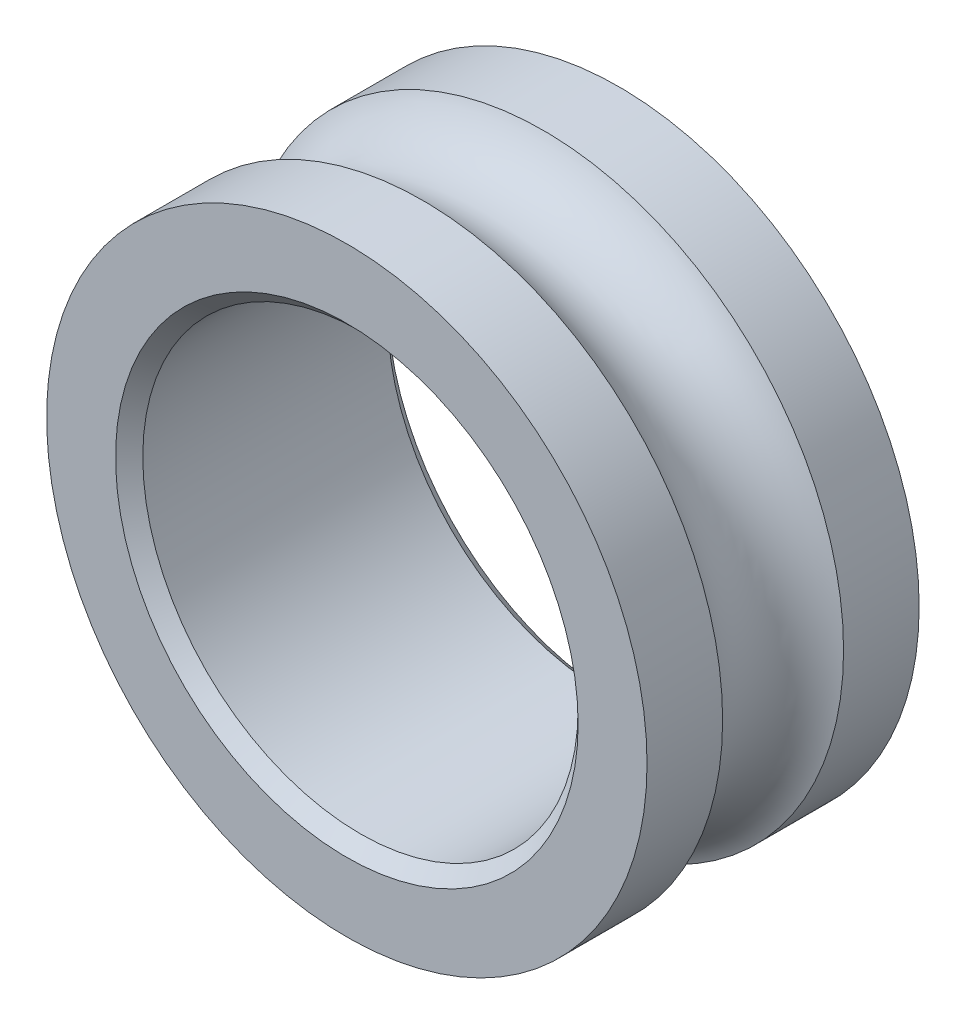
ISO-10303-21;
HEADER;
FILE_DESCRIPTION(('STEP AP214'),'2;1');
FILE_NAME('part.step','',(''),(''),'','','');
FILE_SCHEMA(('AUTOMOTIVE_DESIGN { 1 0 10303 214 1 1 1 1 }'));
ENDSEC;
DATA;
#1=APPLICATION_CONTEXT('core data for automotive mechanical design processes');
#2=APPLICATION_PROTOCOL_DEFINITION('international standard','automotive_design',2000,#1);
#3=PRODUCT_CONTEXT('',#1,'mechanical');
#4=PRODUCT('Part','Part','',(#3));
#5=PRODUCT_RELATED_PRODUCT_CATEGORY('part','',(#4));
#6=PRODUCT_DEFINITION_FORMATION('','',#4);
#7=PRODUCT_DEFINITION_CONTEXT('part definition',#1,'design');
#8=PRODUCT_DEFINITION('design','',#6,#7);
#9=PRODUCT_DEFINITION_SHAPE('','',#8);
#10=(LENGTH_UNIT() NAMED_UNIT(*) SI_UNIT(.MILLI.,.METRE.));
#11=(NAMED_UNIT(*) PLANE_ANGLE_UNIT() SI_UNIT($,.RADIAN.));
#12=(NAMED_UNIT(*) SI_UNIT($,.STERADIAN.) SOLID_ANGLE_UNIT());
#13=UNCERTAINTY_MEASURE_WITH_UNIT(LENGTH_MEASURE(1.E-05),#10,'distance_accuracy_value','');
#14=(GEOMETRIC_REPRESENTATION_CONTEXT(3) GLOBAL_UNCERTAINTY_ASSIGNED_CONTEXT((#13)) GLOBAL_UNIT_ASSIGNED_CONTEXT((#10,
#11,#12)) REPRESENTATION_CONTEXT('',''));
#15=CARTESIAN_POINT('',(0.,0.,0.));
#16=DIRECTION('',(0.,0.,1.));
#17=DIRECTION('',(1.,0.,0.));
#18=AXIS2_PLACEMENT_3D('',#15,#16,#17);
#19=CARTESIAN_POINT('',(0.,0.,0.));
#20=DIRECTION('',(0.,0.,1.));
#21=DIRECTION('',(0.,-1.,0.));
#22=AXIS2_PLACEMENT_3D('',#19,#20,#21);
#23=TOROIDAL_SURFACE('',#22,5.99999999999999,1.21175743903915);
#24=CARTESIAN_POINT('',(0.,0.,1.11111111111111));
#25=DIRECTION('',(0.,0.,1.));
#26=DIRECTION('',(1.,0.,0.));
#27=AXIS2_PLACEMENT_3D('',#24,#25,#26);
#28=CIRCLE('',#27,5.51648351648352);
#29=CARTESIAN_POINT('',(5.51648351648352,0.,1.11111111111111));
#30=VERTEX_POINT('',#29);
#31=EDGE_CURVE('E33',#30,#30,#28,.T.);
#32=ORIENTED_EDGE('',*,*,#31,.F.);
#33=EDGE_LOOP('',(#32));
#34=FACE_BOUND('',#33,.T.);
#35=CARTESIAN_POINT('',(0.,0.,-1.11111111111111));
#36=DIRECTION('',(0.,0.,1.));
#37=DIRECTION('',(1.,0.,0.));
#38=AXIS2_PLACEMENT_3D('',#35,#36,#37);
#39=CIRCLE('',#38,5.51648351648352);
#40=CARTESIAN_POINT('',(5.51648351648352,0.,-1.11111111111111));
#41=VERTEX_POINT('',#40);
#42=EDGE_CURVE('E30',#41,#41,#39,.F.);
#43=ORIENTED_EDGE('',*,*,#42,.F.);
#44=EDGE_LOOP('',(#43));
#45=FACE_BOUND('',#44,.T.);
#46=ADVANCED_FACE('F15',(#34,#45),#23,.F.);
#47=CARTESIAN_POINT('',(0.,0.,2.5));
#48=DIRECTION('',(0.,0.,1.));
#49=DIRECTION('',(1.,0.,0.));
#50=AXIS2_PLACEMENT_3D('',#47,#48,#49);
#51=CYLINDRICAL_SURFACE('',#50,5.51648351648352);
#52=ORIENTED_EDGE('',*,*,#31,.T.);
#53=EDGE_LOOP('',(#52));
#54=FACE_BOUND('',#53,.T.);
#55=CARTESIAN_POINT('',(0.,0.,2.5));
#56=DIRECTION('',(0.,0.,1.));
#57=DIRECTION('',(1.,0.,0.));
#58=AXIS2_PLACEMENT_3D('',#55,#56,#57);
#59=CIRCLE('',#58,5.51648351648352);
#60=CARTESIAN_POINT('',(5.51648351648352,0.,2.5));
#61=VERTEX_POINT('',#60);
#62=EDGE_CURVE('E18',#61,#61,#59,.F.);
#63=ORIENTED_EDGE('',*,*,#62,.T.);
#64=EDGE_LOOP('',(#63));
#65=FACE_BOUND('',#64,.T.);
#66=ADVANCED_FACE('F47',(#54,#65),#51,.T.);
#67=CARTESIAN_POINT('',(0.,0.,2.5));
#68=DIRECTION('',(0.,0.,1.));
#69=DIRECTION('',(1.,0.,0.));
#70=AXIS2_PLACEMENT_3D('',#67,#68,#69);
#71=CYLINDRICAL_SURFACE('',#70,5.51648351648352);
#72=ORIENTED_EDGE('',*,*,#42,.T.);
#73=EDGE_LOOP('',(#72));
#74=FACE_BOUND('',#73,.T.);
#75=CARTESIAN_POINT('',(0.,0.,-2.5));
#76=DIRECTION('',(0.,0.,1.));
#77=DIRECTION('',(1.,0.,0.));
#78=AXIS2_PLACEMENT_3D('',#75,#76,#77);
#79=CIRCLE('',#78,5.51648351648352);
#80=CARTESIAN_POINT('',(5.51648351648352,0.,-2.5));
#81=VERTEX_POINT('',#80);
#82=EDGE_CURVE('E40',#81,#81,#79,.T.);
#83=ORIENTED_EDGE('',*,*,#82,.T.);
#84=EDGE_LOOP('',(#83));
#85=FACE_BOUND('',#84,.T.);
#86=ADVANCED_FACE('F52',(#74,#85),#71,.T.);
#87=CARTESIAN_POINT('',(0.,5.51648351648352,2.5));
#88=DIRECTION('',(0.,0.,-1.));
#89=DIRECTION('',(-1.,0.,0.));
#90=AXIS2_PLACEMENT_3D('',#87,#88,#89);
#91=PLANE('',#90);
#92=CARTESIAN_POINT('',(0.,0.,2.49999999994088));
#93=DIRECTION('',(0.,0.,1.));
#94=DIRECTION('',(1.,0.,0.));
#95=AXIS2_PLACEMENT_3D('',#92,#93,#94);
#96=CIRCLE('',#95,4.25000000007003);
#97=CARTESIAN_POINT('',(4.25000000007003,0.,2.49999999994088));
#98=VERTEX_POINT('',#97);
#99=EDGE_CURVE('E38',#98,#98,#96,.F.);
#100=ORIENTED_EDGE('',*,*,#99,.T.);
#101=EDGE_LOOP('',(#100));
#102=FACE_BOUND('',#101,.T.);
#103=ORIENTED_EDGE('',*,*,#62,.F.);
#104=EDGE_LOOP('',(#103));
#105=FACE_BOUND('',#104,.T.);
#106=ADVANCED_FACE('F49',(#102,#105),#91,.F.);
#107=CARTESIAN_POINT('',(0.,4.25,-2.5));
#108=DIRECTION('',(0.,0.,1.));
#109=DIRECTION('',(1.,0.,0.));
#110=AXIS2_PLACEMENT_3D('',#107,#108,#109);
#111=PLANE('',#110);
#112=ORIENTED_EDGE('',*,*,#82,.F.);
#113=EDGE_LOOP('',(#112));
#114=FACE_BOUND('',#113,.T.);
#115=CARTESIAN_POINT('',(0.,0.,-2.49999999999773));
#116=DIRECTION('',(0.,0.,-1.));
#117=DIRECTION('',(-1.,0.,0.));
#118=AXIS2_PLACEMENT_3D('',#115,#116,#117);
#119=CIRCLE('',#118,4.25000000001319);
#120=CARTESIAN_POINT('',(-4.25000000001319,0.,-2.49999999999773));
#121=VERTEX_POINT('',#120);
#122=EDGE_CURVE('E27',#121,#121,#119,.F.);
#123=ORIENTED_EDGE('',*,*,#122,.T.);
#124=EDGE_LOOP('',(#123));
#125=FACE_BOUND('',#124,.T.);
#126=ADVANCED_FACE('F51',(#114,#125),#111,.F.);
#127=CARTESIAN_POINT('',(0.,0.,2.4999999998272));
#128=DIRECTION('',(0.,0.,1.));
#129=DIRECTION('',(1.,0.,0.));
#130=AXIS2_PLACEMENT_3D('',#127,#128,#129);
#131=CONICAL_SURFACE('',#130,4.24999999995634,0.785398163511135);
#132=ORIENTED_EDGE('',*,*,#99,.F.);
#133=EDGE_LOOP('',(#132));
#134=FACE_BOUND('',#133,.T.);
#135=CARTESIAN_POINT('',(0.,0.,2.25));
#136=DIRECTION('',(0.,0.,1.));
#137=DIRECTION('',(1.,0.,0.));
#138=AXIS2_PLACEMENT_3D('',#135,#136,#137);
#139=CIRCLE('',#138,4.);
#140=CARTESIAN_POINT('',(4.,0.,2.25));
#141=VERTEX_POINT('',#140);
#142=EDGE_CURVE('E22',#141,#141,#139,.F.);
#143=ORIENTED_EDGE('',*,*,#142,.T.);
#144=EDGE_LOOP('',(#143));
#145=FACE_BOUND('',#144,.T.);
#146=ADVANCED_FACE('F60',(#134,#145),#131,.F.);
#147=CARTESIAN_POINT('',(0.,0.,-2.49999999999773));
#148=DIRECTION('',(0.,0.,-1.));
#149=DIRECTION('',(-1.,0.,0.));
#150=AXIS2_PLACEMENT_3D('',#147,#148,#149);
#151=CONICAL_SURFACE('',#150,4.25000000001319,0.785398163397448);
#152=CARTESIAN_POINT('',(0.,0.,-2.25));
#153=DIRECTION('',(0.,0.,1.));
#154=DIRECTION('',(1.,0.,0.));
#155=AXIS2_PLACEMENT_3D('',#152,#153,#154);
#156=CIRCLE('',#155,4.);
#157=CARTESIAN_POINT('',(4.,0.,-2.25));
#158=VERTEX_POINT('',#157);
#159=EDGE_CURVE('E10',#158,#158,#156,.T.);
#160=ORIENTED_EDGE('',*,*,#159,.T.);
#161=EDGE_LOOP('',(#160));
#162=FACE_BOUND('',#161,.T.);
#163=ORIENTED_EDGE('',*,*,#122,.F.);
#164=EDGE_LOOP('',(#163));
#165=FACE_BOUND('',#164,.T.);
#166=ADVANCED_FACE('F67',(#162,#165),#151,.F.);
#167=CARTESIAN_POINT('',(0.,0.,2.5));
#168=DIRECTION('',(0.,0.,1.));
#169=DIRECTION('',(1.,0.,0.));
#170=AXIS2_PLACEMENT_3D('',#167,#168,#169);
#171=CYLINDRICAL_SURFACE('',#170,4.);
#172=ORIENTED_EDGE('',*,*,#142,.F.);
#173=EDGE_LOOP('',(#172));
#174=FACE_BOUND('',#173,.T.);
#175=ORIENTED_EDGE('',*,*,#159,.F.);
#176=EDGE_LOOP('',(#175));
#177=FACE_BOUND('',#176,.T.);
#178=ADVANCED_FACE('F65',(#174,#177),#171,.F.);
#179=CLOSED_SHELL('',(#46,#66,#86,#106,#126,#146,#166,#178));
#180=MANIFOLD_SOLID_BREP('B1',#179);
#181=ADVANCED_BREP_SHAPE_REPRESENTATION('',(#18,#180),#14);
#182=SHAPE_DEFINITION_REPRESENTATION(#9,#181);
ENDSEC;
END-ISO-10303-21;
